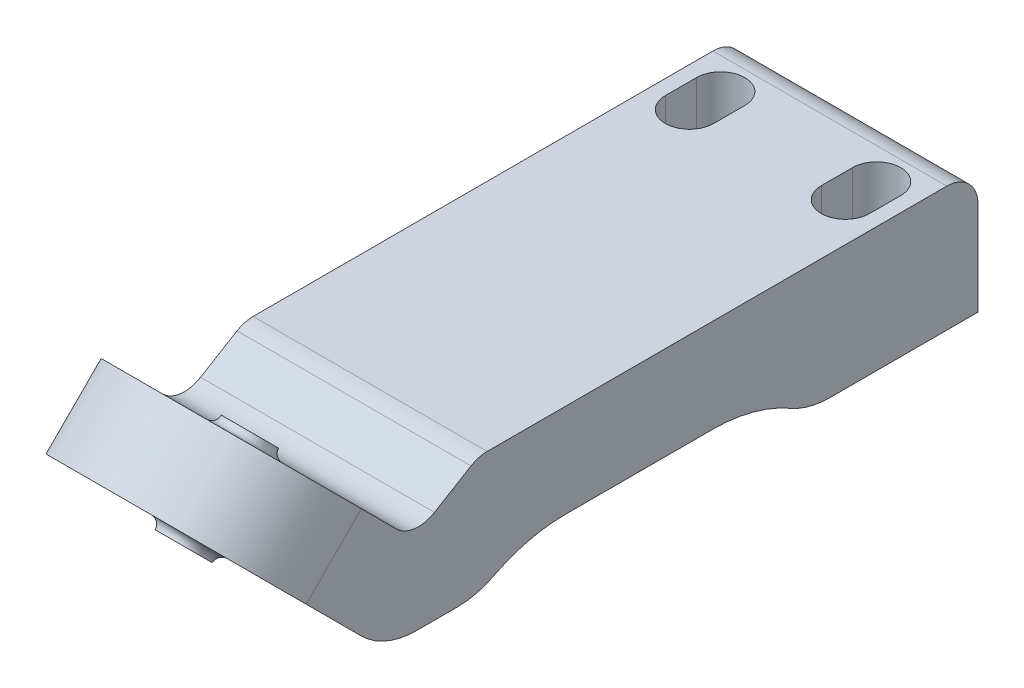
ISO-10303-21;
HEADER;
FILE_DESCRIPTION(('STEP AP214'),'2;1');
FILE_NAME('part.step','',(''),(''),'','','');
FILE_SCHEMA(('AUTOMOTIVE_DESIGN { 1 0 10303 214 1 1 1 1 }'));
ENDSEC;
DATA;
#1=APPLICATION_CONTEXT('core data for automotive mechanical design processes');
#2=APPLICATION_PROTOCOL_DEFINITION('international standard','automotive_design',2000,#1);
#3=PRODUCT_CONTEXT('',#1,'mechanical');
#4=PRODUCT('Part','Part','',(#3));
#5=PRODUCT_RELATED_PRODUCT_CATEGORY('part','',(#4));
#6=PRODUCT_DEFINITION_FORMATION('','',#4);
#7=PRODUCT_DEFINITION_CONTEXT('part definition',#1,'design');
#8=PRODUCT_DEFINITION('design','',#6,#7);
#9=PRODUCT_DEFINITION_SHAPE('','',#8);
#10=(LENGTH_UNIT() NAMED_UNIT(*) SI_UNIT(.MILLI.,.METRE.));
#11=(NAMED_UNIT(*) PLANE_ANGLE_UNIT() SI_UNIT($,.RADIAN.));
#12=(NAMED_UNIT(*) SI_UNIT($,.STERADIAN.) SOLID_ANGLE_UNIT());
#13=UNCERTAINTY_MEASURE_WITH_UNIT(LENGTH_MEASURE(1.E-05),#10,'distance_accuracy_value','');
#14=(GEOMETRIC_REPRESENTATION_CONTEXT(3) GLOBAL_UNCERTAINTY_ASSIGNED_CONTEXT((#13)) GLOBAL_UNIT_ASSIGNED_CONTEXT((#10,
#11,#12)) REPRESENTATION_CONTEXT('',''));
#15=CARTESIAN_POINT('',(0.,0.,0.));
#16=DIRECTION('',(0.,0.,1.));
#17=DIRECTION('',(1.,0.,0.));
#18=AXIS2_PLACEMENT_3D('',#15,#16,#17);
#19=CARTESIAN_POINT('',(-7.5,20.6821178799464,26.));
#20=DIRECTION('',(0.,1.,0.));
#21=DIRECTION('',(0.,0.,1.));
#22=AXIS2_PLACEMENT_3D('',#19,#20,#21);
#23=PLANE('',#22);
#24=DIRECTION('',(0.,0.,-1.));
#25=VECTOR('',#24,1.);
#26=CARTESIAN_POINT('',(6.55,20.6821178799464,26.));
#27=LINE('',#26,#25);
#28=CARTESIAN_POINT('',(6.55,20.6821178799464,6.00000000000001));
#29=VERTEX_POINT('',#28);
#30=CARTESIAN_POINT('',(6.55,20.6821178799464,4.));
#31=VERTEX_POINT('',#30);
#32=EDGE_CURVE('E314',#29,#31,#27,.T.);
#33=ORIENTED_EDGE('',*,*,#32,.T.);
#34=CARTESIAN_POINT('',(5.,20.6821178799464,4.));
#35=DIRECTION('',(0.,1.,0.));
#36=DIRECTION('',(0.,0.,1.));
#37=AXIS2_PLACEMENT_3D('',#34,#35,#36);
#38=CIRCLE('',#37,1.55);
#39=CARTESIAN_POINT('',(3.45,20.6821178799464,4.));
#40=VERTEX_POINT('',#39);
#41=EDGE_CURVE('E317',#31,#40,#38,.T.);
#42=ORIENTED_EDGE('',*,*,#41,.T.);
#43=DIRECTION('',(0.,0.,1.));
#44=VECTOR('',#43,1.);
#45=CARTESIAN_POINT('',(3.45,20.6821178799464,26.));
#46=LINE('',#45,#44);
#47=CARTESIAN_POINT('',(3.45,20.6821178799464,6.00000000000001));
#48=VERTEX_POINT('',#47);
#49=EDGE_CURVE('E308',#40,#48,#46,.T.);
#50=ORIENTED_EDGE('',*,*,#49,.T.);
#51=CARTESIAN_POINT('',(5.,20.6821178799464,6.));
#52=DIRECTION('',(0.,1.,0.));
#53=DIRECTION('',(0.,0.,1.));
#54=AXIS2_PLACEMENT_3D('',#51,#52,#53);
#55=CIRCLE('',#54,1.55);
#56=EDGE_CURVE('E311',#48,#29,#55,.T.);
#57=ORIENTED_EDGE('',*,*,#56,.T.);
#58=EDGE_LOOP('',(#33,#42,#50,#57));
#59=FACE_BOUND('',#58,.T.);
#60=DIRECTION('',(0.,0.,-1.));
#61=VECTOR('',#60,1.);
#62=CARTESIAN_POINT('',(-3.45000000000001,20.6821178799464,26.));
#63=LINE('',#62,#61);
#64=CARTESIAN_POINT('',(-3.45,20.6821178799464,6.));
#65=VERTEX_POINT('',#64);
#66=CARTESIAN_POINT('',(-3.45,20.6821178799464,4.));
#67=VERTEX_POINT('',#66);
#68=EDGE_CURVE('E326',#65,#67,#63,.T.);
#69=ORIENTED_EDGE('',*,*,#68,.T.);
#70=CARTESIAN_POINT('',(-5.,20.6821178799464,4.));
#71=DIRECTION('',(0.,1.,0.));
#72=DIRECTION('',(0.,0.,1.));
#73=AXIS2_PLACEMENT_3D('',#70,#71,#72);
#74=CIRCLE('',#73,1.55);
#75=CARTESIAN_POINT('',(-6.55,20.6821178799464,3.99999999999999));
#76=VERTEX_POINT('',#75);
#77=EDGE_CURVE('E329',#67,#76,#74,.T.);
#78=ORIENTED_EDGE('',*,*,#77,.T.);
#79=DIRECTION('',(0.,0.,1.));
#80=VECTOR('',#79,1.);
#81=CARTESIAN_POINT('',(-6.55,20.6821178799464,26.));
#82=LINE('',#81,#80);
#83=CARTESIAN_POINT('',(-6.55,20.6821178799464,6.));
#84=VERTEX_POINT('',#83);
#85=EDGE_CURVE('E320',#76,#84,#82,.T.);
#86=ORIENTED_EDGE('',*,*,#85,.T.);
#87=CARTESIAN_POINT('',(-5.,20.6821178799464,6.));
#88=DIRECTION('',(0.,1.,0.));
#89=DIRECTION('',(0.,0.,1.));
#90=AXIS2_PLACEMENT_3D('',#87,#88,#89);
#91=CIRCLE('',#90,1.55);
#92=EDGE_CURVE('E323',#84,#65,#91,.T.);
#93=ORIENTED_EDGE('',*,*,#92,.T.);
#94=EDGE_LOOP('',(#69,#78,#86,#93));
#95=FACE_BOUND('',#94,.T.);
#96=DIRECTION('',(0.,0.,-1.));
#97=VECTOR('',#96,1.);
#98=CARTESIAN_POINT('',(7.5,20.6821178799464,26.));
#99=LINE('',#98,#97);
#100=CARTESIAN_POINT('',(7.5,20.6821178799464,9.51668522645211));
#101=VERTEX_POINT('',#100);
#102=CARTESIAN_POINT('',(7.5,20.6821178799464,0.));
#103=VERTEX_POINT('',#102);
#104=EDGE_CURVE('E301',#101,#103,#99,.T.);
#105=ORIENTED_EDGE('',*,*,#104,.F.);
#106=DIRECTION('',(-1.,0.,0.));
#107=VECTOR('',#106,1.);
#108=CARTESIAN_POINT('',(-7.5,20.6821178799464,9.51668522645211));
#109=LINE('',#108,#107);
#110=CARTESIAN_POINT('',(-7.5,20.6821178799464,9.51668522645211));
#111=VERTEX_POINT('',#110);
#112=EDGE_CURVE('E383',#101,#111,#109,.T.);
#113=ORIENTED_EDGE('',*,*,#112,.T.);
#114=DIRECTION('',(0.,0.,-1.));
#115=VECTOR('',#114,1.);
#116=CARTESIAN_POINT('',(-7.5,20.6821178799464,26.));
#117=LINE('',#116,#115);
#118=CARTESIAN_POINT('',(-7.5,20.6821178799464,0.));
#119=VERTEX_POINT('',#118);
#120=EDGE_CURVE('E303',#111,#119,#117,.T.);
#121=ORIENTED_EDGE('',*,*,#120,.T.);
#122=DIRECTION('',(1.,0.,0.));
#123=VECTOR('',#122,1.);
#124=CARTESIAN_POINT('',(-7.5,20.6821178799464,0.));
#125=LINE('',#124,#123);
#126=EDGE_CURVE('E293',#119,#103,#125,.T.);
#127=ORIENTED_EDGE('',*,*,#126,.T.);
#128=EDGE_LOOP('',(#105,#113,#121,#127));
#129=FACE_BOUND('',#128,.T.);
#130=ADVANCED_FACE('F43',(#59,#95,#129),#23,.F.);
#131=CARTESIAN_POINT('',(7.50000000000001,26.,36.));
#132=DIRECTION('',(0.,0.707106781186551,-0.707106781186544));
#133=DIRECTION('',(0.,0.707106781186544,0.707106781186551));
#134=AXIS2_PLACEMENT_3D('',#131,#132,#133);
#135=PLANE('',#134);
#136=CARTESIAN_POINT('',(0.,29.5355339059327,39.5355339059328));
#137=DIRECTION('',(0.,0.707106781186551,-0.707106781186544));
#138=DIRECTION('',(0.,0.707106781186544,0.707106781186551));
#139=AXIS2_PLACEMENT_3D('',#136,#137,#138);
#140=CIRCLE('',#139,2.);
#141=CARTESIAN_POINT('',(0.,30.9497474683058,40.9497474683059));
#142=VERTEX_POINT('',#141);
#143=EDGE_CURVE('E335',#142,#142,#140,.F.);
#144=ORIENTED_EDGE('',*,*,#143,.T.);
#145=EDGE_LOOP('',(#144));
#146=FACE_BOUND('',#145,.T.);
#147=DIRECTION('',(0.,-0.707106781186544,-0.707106781186551));
#148=VECTOR('',#147,1.);
#149=CARTESIAN_POINT('',(7.50000000000001,26.,36.));
#150=LINE('',#149,#148);
#151=CARTESIAN_POINT('',(7.50000000000001,29.5355339059327,39.5355339059327));
#152=VERTEX_POINT('',#151);
#153=CARTESIAN_POINT('',(7.50000000000001,27.2901535386176,37.2901535386177));
#154=VERTEX_POINT('',#153);
#155=EDGE_CURVE('E242',#152,#154,#150,.T.);
#156=ORIENTED_EDGE('',*,*,#155,.T.);
#157=DIRECTION('',(-1.,0.,0.));
#158=VECTOR('',#157,1.);
#159=CARTESIAN_POINT('',(7.50000000000001,27.2901535386176,37.2901535386177));
#160=LINE('',#159,#158);
#161=CARTESIAN_POINT('',(-7.5,27.2901535386176,37.2901535386177));
#162=VERTEX_POINT('',#161);
#163=EDGE_CURVE('E232',#154,#162,#160,.T.);
#164=ORIENTED_EDGE('',*,*,#163,.T.);
#165=DIRECTION('',(0.,-0.707106781186544,-0.707106781186551));
#166=VECTOR('',#165,1.);
#167=CARTESIAN_POINT('',(-7.5,26.,36.));
#168=LINE('',#167,#166);
#169=CARTESIAN_POINT('',(-7.5,29.5355339059327,39.5355339059327));
#170=VERTEX_POINT('',#169);
#171=EDGE_CURVE('E225',#170,#162,#168,.T.);
#172=ORIENTED_EDGE('',*,*,#171,.F.);
#173=CARTESIAN_POINT('',(0.,29.5355339059327,39.5355339059327));
#174=DIRECTION('',(0.,-0.707106781186551,0.707106781186544));
#175=DIRECTION('',(0.,0.707106781186544,0.707106781186551));
#176=AXIS2_PLACEMENT_3D('',#173,#174,#175);
#177=CIRCLE('',#176,7.5);
#178=EDGE_CURVE('E209',#152,#170,#177,.T.);
#179=ORIENTED_EDGE('',*,*,#178,.F.);
#180=EDGE_LOOP('',(#156,#164,#172,#179));
#181=FACE_BOUND('',#180,.T.);
#182=ADVANCED_FACE('F230',(#146,#181),#135,.T.);
#183=CARTESIAN_POINT('',(7.50000000000001,26.,43.0710678118655));
#184=DIRECTION('',(0.,-0.707106781186551,0.707106781186544));
#185=DIRECTION('',(0.,-0.707106781186544,-0.707106781186551));
#186=AXIS2_PLACEMENT_3D('',#183,#184,#185);
#187=PLANE('',#186);
#188=CARTESIAN_POINT('',(0.,26.,43.0710678118655));
#189=DIRECTION('',(0.,-0.707106781186551,0.707106781186544));
#190=DIRECTION('',(0.,-0.707106781186544,-0.707106781186551));
#191=AXIS2_PLACEMENT_3D('',#188,#189,#190);
#192=CIRCLE('',#191,2.);
#193=CARTESIAN_POINT('',(0.,24.5857864376269,41.6568542494924));
#194=VERTEX_POINT('',#193);
#195=EDGE_CURVE('E332',#194,#194,#192,.F.);
#196=ORIENTED_EDGE('',*,*,#195,.T.);
#197=EDGE_LOOP('',(#196));
#198=FACE_BOUND('',#197,.T.);
#199=DIRECTION('',(0.,0.707106781186544,0.707106781186551));
#200=VECTOR('',#199,1.);
#201=CARTESIAN_POINT('',(-7.5,26.,43.0710678118655));
#202=LINE('',#201,#200);
#203=CARTESIAN_POINT('',(-7.5,22.4644660940672,39.5355339059327));
#204=VERTEX_POINT('',#203);
#205=CARTESIAN_POINT('',(-7.5,26.,43.0710678118655));
#206=VERTEX_POINT('',#205);
#207=EDGE_CURVE('E220',#204,#206,#202,.T.);
#208=ORIENTED_EDGE('',*,*,#207,.F.);
#209=DIRECTION('',(-1.,0.,0.));
#210=VECTOR('',#209,1.);
#211=CARTESIAN_POINT('',(7.50000000000001,22.4644660940672,39.5355339059327));
#212=LINE('',#211,#210);
#213=CARTESIAN_POINT('',(7.50000000000001,22.4644660940672,39.5355339059327));
#214=VERTEX_POINT('',#213);
#215=EDGE_CURVE('E397',#204,#214,#212,.F.);
#216=ORIENTED_EDGE('',*,*,#215,.T.);
#217=DIRECTION('',(0.,0.707106781186544,0.707106781186551));
#218=VECTOR('',#217,1.);
#219=CARTESIAN_POINT('',(7.50000000000001,26.,43.0710678118655));
#220=LINE('',#219,#218);
#221=CARTESIAN_POINT('',(7.50000000000001,26.,43.0710678118655));
#222=VERTEX_POINT('',#221);
#223=EDGE_CURVE('E233',#214,#222,#220,.T.);
#224=ORIENTED_EDGE('',*,*,#223,.T.);
#225=CARTESIAN_POINT('',(0.,26.,43.0710678118655));
#226=DIRECTION('',(0.,-0.707106781186551,0.707106781186544));
#227=DIRECTION('',(0.,0.707106781186544,0.707106781186551));
#228=AXIS2_PLACEMENT_3D('',#225,#226,#227);
#229=CIRCLE('',#228,7.5);
#230=EDGE_CURVE('E221',#222,#206,#229,.T.);
#231=ORIENTED_EDGE('',*,*,#230,.T.);
#232=EDGE_LOOP('',(#208,#216,#224,#231));
#233=FACE_BOUND('',#232,.T.);
#234=ADVANCED_FACE('F436',(#198,#233),#187,.T.);
#235=CARTESIAN_POINT('',(7.5,28.6821178799464,26.));
#236=DIRECTION('',(0.,-1.,0.));
#237=DIRECTION('',(0.,0.,-1.));
#238=AXIS2_PLACEMENT_3D('',#235,#236,#237);
#239=PLANE('',#238);
#240=DIRECTION('',(0.,0.,1.));
#241=VECTOR('',#240,1.);
#242=CARTESIAN_POINT('',(-6.55,28.6821178799464,3.99999999999999));
#243=LINE('',#242,#241);
#244=CARTESIAN_POINT('',(-6.55,28.6821178799464,3.99999999999999));
#245=VERTEX_POINT('',#244);
#246=CARTESIAN_POINT('',(-6.55,28.6821178799464,6.00000000000001));
#247=VERTEX_POINT('',#246);
#248=EDGE_CURVE('E254',#245,#247,#243,.T.);
#249=ORIENTED_EDGE('',*,*,#248,.F.);
#250=CARTESIAN_POINT('',(-5.,28.6821178799464,4.));
#251=DIRECTION('',(0.,1.,0.));
#252=DIRECTION('',(0.,0.,1.));
#253=AXIS2_PLACEMENT_3D('',#250,#251,#252);
#254=CIRCLE('',#253,1.55);
#255=CARTESIAN_POINT('',(-3.45,28.6821178799464,4.));
#256=VERTEX_POINT('',#255);
#257=EDGE_CURVE('E252',#256,#245,#254,.T.);
#258=ORIENTED_EDGE('',*,*,#257,.F.);
#259=DIRECTION('',(0.,0.,-1.));
#260=VECTOR('',#259,1.);
#261=CARTESIAN_POINT('',(-3.45,28.6821178799464,4.));
#262=LINE('',#261,#260);
#263=CARTESIAN_POINT('',(-3.45,28.6821178799464,6.));
#264=VERTEX_POINT('',#263);
#265=EDGE_CURVE('E261',#264,#256,#262,.T.);
#266=ORIENTED_EDGE('',*,*,#265,.F.);
#267=CARTESIAN_POINT('',(-5.,28.6821178799464,6.));
#268=DIRECTION('',(0.,1.,0.));
#269=DIRECTION('',(0.,0.,1.));
#270=AXIS2_PLACEMENT_3D('',#267,#268,#269);
#271=CIRCLE('',#270,1.55);
#272=EDGE_CURVE('E258',#247,#264,#271,.T.);
#273=ORIENTED_EDGE('',*,*,#272,.F.);
#274=EDGE_LOOP('',(#249,#258,#266,#273));
#275=FACE_BOUND('',#274,.T.);
#276=DIRECTION('',(0.,0.,1.));
#277=VECTOR('',#276,1.);
#278=CARTESIAN_POINT('',(3.45,28.6821178799464,4.));
#279=LINE('',#278,#277);
#280=CARTESIAN_POINT('',(3.45000000000001,28.6821178799464,4.));
#281=VERTEX_POINT('',#280);
#282=CARTESIAN_POINT('',(3.45,28.6821178799464,6.00000000000001));
#283=VERTEX_POINT('',#282);
#284=EDGE_CURVE('E288',#281,#283,#279,.T.);
#285=ORIENTED_EDGE('',*,*,#284,.F.);
#286=CARTESIAN_POINT('',(5.,28.6821178799464,4.));
#287=DIRECTION('',(0.,1.,0.));
#288=DIRECTION('',(0.,0.,-1.));
#289=AXIS2_PLACEMENT_3D('',#286,#287,#288);
#290=CIRCLE('',#289,1.55);
#291=CARTESIAN_POINT('',(6.55,28.6821178799464,4.));
#292=VERTEX_POINT('',#291);
#293=EDGE_CURVE('E255',#292,#281,#290,.T.);
#294=ORIENTED_EDGE('',*,*,#293,.F.);
#295=DIRECTION('',(0.,0.,-1.));
#296=VECTOR('',#295,1.);
#297=CARTESIAN_POINT('',(6.55,28.6821178799464,4.));
#298=LINE('',#297,#296);
#299=CARTESIAN_POINT('',(6.55,28.6821178799464,6.00000000000001));
#300=VERTEX_POINT('',#299);
#301=EDGE_CURVE('E277',#300,#292,#298,.T.);
#302=ORIENTED_EDGE('',*,*,#301,.F.);
#303=CARTESIAN_POINT('',(5.,28.6821178799464,6.));
#304=DIRECTION('',(0.,1.,0.));
#305=DIRECTION('',(0.,0.,-1.));
#306=AXIS2_PLACEMENT_3D('',#303,#304,#305);
#307=CIRCLE('',#306,1.55);
#308=EDGE_CURVE('E285',#283,#300,#307,.T.);
#309=ORIENTED_EDGE('',*,*,#308,.F.);
#310=EDGE_LOOP('',(#285,#294,#302,#309));
#311=FACE_BOUND('',#310,.T.);
#312=DIRECTION('',(0.,0.,-1.));
#313=VECTOR('',#312,1.);
#314=CARTESIAN_POINT('',(7.5,28.6821178799464,26.));
#315=LINE('',#314,#313);
#316=CARTESIAN_POINT('',(7.5,28.6821178799464,31.4751117573865));
#317=VERTEX_POINT('',#316);
#318=CARTESIAN_POINT('',(7.5,28.6821178799464,2.00000000000001));
#319=VERTEX_POINT('',#318);
#320=EDGE_CURVE('E298',#317,#319,#315,.T.);
#321=ORIENTED_EDGE('',*,*,#320,.T.);
#322=DIRECTION('',(-1.,0.,0.));
#323=VECTOR('',#322,1.);
#324=CARTESIAN_POINT('',(7.5,28.6821178799464,2.));
#325=LINE('',#324,#323);
#326=CARTESIAN_POINT('',(-7.5,28.6821178799464,2.00000000000001));
#327=VERTEX_POINT('',#326);
#328=EDGE_CURVE('E401',#319,#327,#325,.T.);
#329=ORIENTED_EDGE('',*,*,#328,.T.);
#330=DIRECTION('',(0.,0.,-1.));
#331=VECTOR('',#330,1.);
#332=CARTESIAN_POINT('',(-7.5,28.6821178799464,26.));
#333=LINE('',#332,#331);
#334=CARTESIAN_POINT('',(-7.5,28.6821178799464,31.4751117573865));
#335=VERTEX_POINT('',#334);
#336=EDGE_CURVE('E306',#335,#327,#333,.T.);
#337=ORIENTED_EDGE('',*,*,#336,.F.);
#338=DIRECTION('',(1.,0.,0.));
#339=VECTOR('',#338,1.);
#340=CARTESIAN_POINT('',(7.5,28.6821178799464,31.4751117573865));
#341=LINE('',#340,#339);
#342=EDGE_CURVE('E344',#335,#317,#341,.T.);
#343=ORIENTED_EDGE('',*,*,#342,.T.);
#344=EDGE_LOOP('',(#321,#329,#337,#343));
#345=FACE_BOUND('',#344,.T.);
#346=ADVANCED_FACE('F407',(#275,#311,#345),#239,.F.);
#347=CARTESIAN_POINT('',(-7.5,28.6821178799464,26.));
#348=DIRECTION('',(1.,0.,0.));
#349=DIRECTION('',(0.,0.,-1.));
#350=AXIS2_PLACEMENT_3D('',#347,#348,#349);
#351=PLANE('',#350);
#352=ORIENTED_EDGE('',*,*,#336,.T.);
#353=CARTESIAN_POINT('',(-7.5,26.6821178799464,2.));
#354=DIRECTION('',(1.,0.,0.));
#355=DIRECTION('',(0.,0.,-1.));
#356=AXIS2_PLACEMENT_3D('',#353,#354,#355);
#357=CIRCLE('',#356,2.);
#358=CARTESIAN_POINT('',(-7.5,26.6821178799464,0.));
#359=VERTEX_POINT('',#358);
#360=EDGE_CURVE('E65',#327,#359,#357,.F.);
#361=ORIENTED_EDGE('',*,*,#360,.T.);
#362=DIRECTION('',(0.,-1.,0.));
#363=VECTOR('',#362,1.);
#364=CARTESIAN_POINT('',(-7.5,28.6821178799464,0.));
#365=LINE('',#364,#363);
#366=EDGE_CURVE('E267',#359,#119,#365,.T.);
#367=ORIENTED_EDGE('',*,*,#366,.T.);
#368=ORIENTED_EDGE('',*,*,#120,.F.);
#369=CARTESIAN_POINT('',(-7.5,25.6821178799464,9.51668522645211));
#370=DIRECTION('',(1.,0.,0.));
#371=DIRECTION('',(0.,0.,-1.));
#372=AXIS2_PLACEMENT_3D('',#369,#370,#371);
#373=CIRCLE('',#372,5.);
#374=CARTESIAN_POINT('',(-7.5,21.3487845466131,12.0111234843014));
#375=VERTEX_POINT('',#374);
#376=EDGE_CURVE('E389',#111,#375,#373,.F.);
#377=ORIENTED_EDGE('',*,*,#376,.T.);
#378=CARTESIAN_POINT('',(-7.5,12.6821178799464,17.));
#379=DIRECTION('',(1.,0.,0.));
#380=DIRECTION('',(0.,0.,-1.));
#381=AXIS2_PLACEMENT_3D('',#378,#379,#380);
#382=CIRCLE('',#381,10.);
#383=CARTESIAN_POINT('',(-7.5,22.6821178799464,17.));
#384=VERTEX_POINT('',#383);
#385=EDGE_CURVE('E364',#375,#384,#382,.T.);
#386=ORIENTED_EDGE('',*,*,#385,.T.);
#387=DIRECTION('',(0.,0.,-1.));
#388=VECTOR('',#387,1.);
#389=CARTESIAN_POINT('',(-7.5,22.6821178799464,32.));
#390=LINE('',#389,#388);
#391=CARTESIAN_POINT('',(-7.5,22.6821178799464,26.4490688135329));
#392=VERTEX_POINT('',#391);
#393=EDGE_CURVE('E248',#392,#384,#390,.T.);
#394=ORIENTED_EDGE('',*,*,#393,.F.);
#395=CARTESIAN_POINT('',(-7.5,12.6821178799464,26.4490688135329));
#396=DIRECTION('',(1.,0.,0.));
#397=DIRECTION('',(0.,0.,-1.));
#398=AXIS2_PLACEMENT_3D('',#395,#396,#397);
#399=CIRCLE('',#398,10.);
#400=CARTESIAN_POINT('',(-7.5,21.5607059599821,31.0502288525934));
#401=VERTEX_POINT('',#400);
#402=EDGE_CURVE('E371',#392,#401,#399,.T.);
#403=ORIENTED_EDGE('',*,*,#402,.T.);
#404=CARTESIAN_POINT('',(-7.5,26.,33.3508088721237));
#405=DIRECTION('',(1.,0.,0.));
#406=DIRECTION('',(0.,0.,-1.));
#407=AXIS2_PLACEMENT_3D('',#404,#405,#406);
#408=CIRCLE('',#407,5.);
#409=CARTESIAN_POINT('',(-7.5,21.,33.3508088721237));
#410=VERTEX_POINT('',#409);
#411=EDGE_CURVE('E385',#401,#410,#408,.F.);
#412=ORIENTED_EDGE('',*,*,#411,.T.);
#413=DIRECTION('',(0.,0.,-1.));
#414=VECTOR('',#413,1.);
#415=CARTESIAN_POINT('',(-7.5,21.,36.));
#416=LINE('',#415,#414);
#417=CARTESIAN_POINT('',(-7.5,21.,36.));
#418=VERTEX_POINT('',#417);
#419=EDGE_CURVE('E241',#418,#410,#416,.T.);
#420=ORIENTED_EDGE('',*,*,#419,.F.);
#421=CARTESIAN_POINT('',(-7.5,26.,36.));
#422=DIRECTION('',(1.,0.,0.));
#423=DIRECTION('',(0.,0.,-1.));
#424=AXIS2_PLACEMENT_3D('',#421,#422,#423);
#425=CIRCLE('',#424,5.);
#426=EDGE_CURVE('E387',#418,#204,#425,.F.);
#427=ORIENTED_EDGE('',*,*,#426,.T.);
#428=ORIENTED_EDGE('',*,*,#207,.T.);
#429=DIRECTION('',(0.,0.707106781186551,-0.707106781186544));
#430=VECTOR('',#429,1.);
#431=CARTESIAN_POINT('',(-7.5,29.5355339059327,39.5355339059328));
#432=LINE('',#431,#430);
#433=EDGE_CURVE('E213',#206,#170,#432,.T.);
#434=ORIENTED_EDGE('',*,*,#433,.T.);
#435=ORIENTED_EDGE('',*,*,#171,.T.);
#436=CARTESIAN_POINT('',(-7.5,28.7043671009907,35.8759399762446));
#437=DIRECTION('',(1.,0.,0.));
#438=DIRECTION('',(0.,0.,-1.));
#439=AXIS2_PLACEMENT_3D('',#436,#437,#438);
#440=CIRCLE('',#439,2.);
#441=CARTESIAN_POINT('',(-7.5,26.9900324995865,34.8458638264245));
#442=VERTEX_POINT('',#441);
#443=EDGE_CURVE('E356',#162,#442,#440,.T.);
#444=ORIENTED_EDGE('',*,*,#443,.T.);
#445=DIRECTION('',(0.,0.515038074910051,-0.857167300702114));
#446=VECTOR('',#445,1.);
#447=CARTESIAN_POINT('',(-7.5,31.3440992919738,27.5994797990706));
#448=LINE('',#447,#446);
#449=CARTESIAN_POINT('',(-7.5,28.3964524813507,32.5051879072065));
#450=VERTEX_POINT('',#449);
#451=EDGE_CURVE('E338',#442,#450,#448,.T.);
#452=ORIENTED_EDGE('',*,*,#451,.T.);
#453=CARTESIAN_POINT('',(-7.5,26.6821178799464,31.4751117573865));
#454=DIRECTION('',(1.,0.,0.));
#455=DIRECTION('',(0.,0.,-1.));
#456=AXIS2_PLACEMENT_3D('',#453,#454,#455);
#457=CIRCLE('',#456,2.);
#458=EDGE_CURVE('E353',#450,#335,#457,.F.);
#459=ORIENTED_EDGE('',*,*,#458,.T.);
#460=EDGE_LOOP('',(#352,#361,#367,#368,#377,#386,#394,#403,#412,#420,#427,#428,#434,#435,#444,
#452,#459));
#461=FACE_BOUND('',#460,.T.);
#462=ADVANCED_FACE('F224',(#461),#351,.F.);
#463=CARTESIAN_POINT('',(7.5,20.6821178799464,26.));
#464=DIRECTION('',(-1.,0.,0.));
#465=DIRECTION('',(0.,0.,1.));
#466=AXIS2_PLACEMENT_3D('',#463,#464,#465);
#467=PLANE('',#466);
#468=DIRECTION('',(0.,1.,0.));
#469=VECTOR('',#468,1.);
#470=CARTESIAN_POINT('',(7.5,20.6821178799464,0.));
#471=LINE('',#470,#469);
#472=CARTESIAN_POINT('',(7.5,26.6821178799464,0.));
#473=VERTEX_POINT('',#472);
#474=EDGE_CURVE('E296',#103,#473,#471,.T.);
#475=ORIENTED_EDGE('',*,*,#474,.T.);
#476=CARTESIAN_POINT('',(7.5,26.6821178799464,2.));
#477=DIRECTION('',(-1.,0.,0.));
#478=DIRECTION('',(0.,0.,1.));
#479=AXIS2_PLACEMENT_3D('',#476,#477,#478);
#480=CIRCLE('',#479,2.);
#481=EDGE_CURVE('E11',#473,#319,#480,.F.);
#482=ORIENTED_EDGE('',*,*,#481,.T.);
#483=ORIENTED_EDGE('',*,*,#320,.F.);
#484=CARTESIAN_POINT('',(7.5,26.6821178799464,31.4751117573865));
#485=DIRECTION('',(-1.,0.,0.));
#486=DIRECTION('',(0.,0.,1.));
#487=AXIS2_PLACEMENT_3D('',#484,#485,#486);
#488=CIRCLE('',#487,2.);
#489=CARTESIAN_POINT('',(7.5,28.3964524813507,32.5051879072065));
#490=VERTEX_POINT('',#489);
#491=EDGE_CURVE('E347',#317,#490,#488,.F.);
#492=ORIENTED_EDGE('',*,*,#491,.T.);
#493=DIRECTION('',(0.,-0.515038074910051,0.857167300702114));
#494=VECTOR('',#493,1.);
#495=CARTESIAN_POINT('',(7.5,29.2219855431173,31.1312701705063));
#496=LINE('',#495,#494);
#497=CARTESIAN_POINT('',(7.5,26.9900324995865,34.8458638264245));
#498=VERTEX_POINT('',#497);
#499=EDGE_CURVE('E341',#490,#498,#496,.T.);
#500=ORIENTED_EDGE('',*,*,#499,.T.);
#501=CARTESIAN_POINT('',(7.5,28.7043671009907,35.8759399762446));
#502=DIRECTION('',(-1.,0.,0.));
#503=DIRECTION('',(0.,0.,1.));
#504=AXIS2_PLACEMENT_3D('',#501,#502,#503);
#505=CIRCLE('',#504,2.);
#506=EDGE_CURVE('E358',#498,#154,#505,.T.);
#507=ORIENTED_EDGE('',*,*,#506,.T.);
#508=ORIENTED_EDGE('',*,*,#155,.F.);
#509=DIRECTION('',(0.,0.707106781186551,-0.707106781186544));
#510=VECTOR('',#509,1.);
#511=CARTESIAN_POINT('',(7.50000000000001,29.5355339059327,39.5355339059328));
#512=LINE('',#511,#510);
#513=EDGE_CURVE('E215',#222,#152,#512,.T.);
#514=ORIENTED_EDGE('',*,*,#513,.F.);
#515=ORIENTED_EDGE('',*,*,#223,.F.);
#516=CARTESIAN_POINT('',(7.5,26.,36.));
#517=DIRECTION('',(-1.,0.,0.));
#518=DIRECTION('',(0.,0.,1.));
#519=AXIS2_PLACEMENT_3D('',#516,#517,#518);
#520=CIRCLE('',#519,5.);
#521=CARTESIAN_POINT('',(7.5,21.,36.));
#522=VERTEX_POINT('',#521);
#523=EDGE_CURVE('E379',#214,#522,#520,.F.);
#524=ORIENTED_EDGE('',*,*,#523,.T.);
#525=DIRECTION('',(0.,0.,-1.));
#526=VECTOR('',#525,1.);
#527=CARTESIAN_POINT('',(7.5,21.,36.));
#528=LINE('',#527,#526);
#529=CARTESIAN_POINT('',(7.5,21.,33.3508088721237));
#530=VERTEX_POINT('',#529);
#531=EDGE_CURVE('E238',#522,#530,#528,.T.);
#532=ORIENTED_EDGE('',*,*,#531,.T.);
#533=CARTESIAN_POINT('',(7.5,26.,33.3508088721237));
#534=DIRECTION('',(-1.,0.,0.));
#535=DIRECTION('',(0.,0.,1.));
#536=AXIS2_PLACEMENT_3D('',#533,#534,#535);
#537=CIRCLE('',#536,5.);
#538=CARTESIAN_POINT('',(7.5,21.5607059599821,31.0502288525934));
#539=VERTEX_POINT('',#538);
#540=EDGE_CURVE('E377',#530,#539,#537,.F.);
#541=ORIENTED_EDGE('',*,*,#540,.T.);
#542=CARTESIAN_POINT('',(7.5,12.6821178799464,26.4490688135329));
#543=DIRECTION('',(-1.,0.,0.));
#544=DIRECTION('',(0.,0.,1.));
#545=AXIS2_PLACEMENT_3D('',#542,#543,#544);
#546=CIRCLE('',#545,10.);
#547=CARTESIAN_POINT('',(7.5,22.6821178799464,26.4490688135329));
#548=VERTEX_POINT('',#547);
#549=EDGE_CURVE('E369',#539,#548,#546,.T.);
#550=ORIENTED_EDGE('',*,*,#549,.T.);
#551=DIRECTION('',(0.,0.,-1.));
#552=VECTOR('',#551,1.);
#553=CARTESIAN_POINT('',(7.5,22.6821178799464,32.));
#554=LINE('',#553,#552);
#555=CARTESIAN_POINT('',(7.5,22.6821178799464,17.));
#556=VERTEX_POINT('',#555);
#557=EDGE_CURVE('E245',#548,#556,#554,.T.);
#558=ORIENTED_EDGE('',*,*,#557,.T.);
#559=CARTESIAN_POINT('',(7.5,12.6821178799464,17.));
#560=DIRECTION('',(-1.,0.,0.));
#561=DIRECTION('',(0.,0.,1.));
#562=AXIS2_PLACEMENT_3D('',#559,#560,#561);
#563=CIRCLE('',#562,10.);
#564=CARTESIAN_POINT('',(7.5,21.3487845466131,12.0111234843014));
#565=VERTEX_POINT('',#564);
#566=EDGE_CURVE('E366',#556,#565,#563,.T.);
#567=ORIENTED_EDGE('',*,*,#566,.T.);
#568=CARTESIAN_POINT('',(7.5,25.6821178799464,9.51668522645211));
#569=DIRECTION('',(-1.,0.,0.));
#570=DIRECTION('',(0.,0.,1.));
#571=AXIS2_PLACEMENT_3D('',#568,#569,#570);
#572=CIRCLE('',#571,5.);
#573=EDGE_CURVE('E381',#565,#101,#572,.F.);
#574=ORIENTED_EDGE('',*,*,#573,.T.);
#575=ORIENTED_EDGE('',*,*,#104,.T.);
#576=EDGE_LOOP('',(#475,#482,#483,#492,#500,#507,#508,#514,#515,#524,#532,#541,#550,#558,#567,
#574,#575));
#577=FACE_BOUND('',#576,.T.);
#578=ADVANCED_FACE('F418',(#577),#467,.F.);
#579=CARTESIAN_POINT('',(0.,0.,0.));
#580=DIRECTION('',(0.,0.,1.));
#581=DIRECTION('',(1.,0.,0.));
#582=AXIS2_PLACEMENT_3D('',#579,#580,#581);
#583=PLANE('',#582);
#584=ORIENTED_EDGE('',*,*,#366,.F.);
#585=DIRECTION('',(-1.,0.,0.));
#586=VECTOR('',#585,1.);
#587=CARTESIAN_POINT('',(0.,26.6821178799464,0.));
#588=LINE('',#587,#586);
#589=EDGE_CURVE('E51',#359,#473,#588,.F.);
#590=ORIENTED_EDGE('',*,*,#589,.T.);
#591=ORIENTED_EDGE('',*,*,#474,.F.);
#592=ORIENTED_EDGE('',*,*,#126,.F.);
#593=EDGE_LOOP('',(#584,#590,#591,#592));
#594=FACE_BOUND('',#593,.T.);
#595=ADVANCED_FACE('F514',(#594),#583,.F.);
#596=CARTESIAN_POINT('',(5.,17.6821178799464,4.));
#597=DIRECTION('',(0.,1.,0.));
#598=DIRECTION('',(0.,0.,1.));
#599=AXIS2_PLACEMENT_3D('',#596,#597,#598);
#600=CYLINDRICAL_SURFACE('',#599,1.55);
#601=DIRECTION('',(0.,1.,0.));
#602=VECTOR('',#601,1.);
#603=CARTESIAN_POINT('',(6.55,17.6821178799464,4.));
#604=LINE('',#603,#602);
#605=EDGE_CURVE('E251',#31,#292,#604,.T.);
#606=ORIENTED_EDGE('',*,*,#605,.T.);
#607=ORIENTED_EDGE('',*,*,#293,.T.);
#608=DIRECTION('',(0.,1.,0.));
#609=VECTOR('',#608,1.);
#610=CARTESIAN_POINT('',(3.45,17.6821178799464,4.));
#611=LINE('',#610,#609);
#612=EDGE_CURVE('E274',#40,#281,#611,.T.);
#613=ORIENTED_EDGE('',*,*,#612,.F.);
#614=ORIENTED_EDGE('',*,*,#41,.F.);
#615=EDGE_LOOP('',(#606,#607,#613,#614));
#616=FACE_BOUND('',#615,.T.);
#617=ADVANCED_FACE('F515',(#616),#600,.F.);
#618=CARTESIAN_POINT('',(6.55,17.6821178799464,4.));
#619=DIRECTION('',(1.,0.,0.));
#620=DIRECTION('',(0.,0.,-1.));
#621=AXIS2_PLACEMENT_3D('',#618,#619,#620);
#622=PLANE('',#621);
#623=DIRECTION('',(0.,1.,0.));
#624=VECTOR('',#623,1.);
#625=CARTESIAN_POINT('',(6.55,17.6821178799464,6.00000000000001));
#626=LINE('',#625,#624);
#627=EDGE_CURVE('E280',#29,#300,#626,.T.);
#628=ORIENTED_EDGE('',*,*,#627,.T.);
#629=ORIENTED_EDGE('',*,*,#301,.T.);
#630=ORIENTED_EDGE('',*,*,#605,.F.);
#631=ORIENTED_EDGE('',*,*,#32,.F.);
#632=EDGE_LOOP('',(#628,#629,#630,#631));
#633=FACE_BOUND('',#632,.T.);
#634=ADVANCED_FACE('F520',(#633),#622,.F.);
#635=CARTESIAN_POINT('',(5.,17.6821178799464,6.));
#636=DIRECTION('',(0.,1.,0.));
#637=DIRECTION('',(0.,0.,1.));
#638=AXIS2_PLACEMENT_3D('',#635,#636,#637);
#639=CYLINDRICAL_SURFACE('',#638,1.55);
#640=DIRECTION('',(0.,1.,0.));
#641=VECTOR('',#640,1.);
#642=CARTESIAN_POINT('',(3.45,17.6821178799464,6.00000000000001));
#643=LINE('',#642,#641);
#644=EDGE_CURVE('E278',#48,#283,#643,.T.);
#645=ORIENTED_EDGE('',*,*,#644,.T.);
#646=ORIENTED_EDGE('',*,*,#308,.T.);
#647=ORIENTED_EDGE('',*,*,#627,.F.);
#648=ORIENTED_EDGE('',*,*,#56,.F.);
#649=EDGE_LOOP('',(#645,#646,#647,#648));
#650=FACE_BOUND('',#649,.T.);
#651=ADVANCED_FACE('F526',(#650),#639,.F.);
#652=CARTESIAN_POINT('',(3.45,17.6821178799464,4.));
#653=DIRECTION('',(-1.,0.,0.));
#654=DIRECTION('',(0.,0.,1.));
#655=AXIS2_PLACEMENT_3D('',#652,#653,#654);
#656=PLANE('',#655);
#657=ORIENTED_EDGE('',*,*,#612,.T.);
#658=ORIENTED_EDGE('',*,*,#284,.T.);
#659=ORIENTED_EDGE('',*,*,#644,.F.);
#660=ORIENTED_EDGE('',*,*,#49,.F.);
#661=EDGE_LOOP('',(#657,#658,#659,#660));
#662=FACE_BOUND('',#661,.T.);
#663=ADVANCED_FACE('F530',(#662),#656,.F.);
#664=CARTESIAN_POINT('',(-5.,17.6821178799464,4.));
#665=DIRECTION('',(0.,1.,0.));
#666=DIRECTION('',(0.,0.,1.));
#667=AXIS2_PLACEMENT_3D('',#664,#665,#666);
#668=CYLINDRICAL_SURFACE('',#667,1.55);
#669=DIRECTION('',(0.,1.,0.));
#670=VECTOR('',#669,1.);
#671=CARTESIAN_POINT('',(-3.45,17.6821178799464,4.));
#672=LINE('',#671,#670);
#673=EDGE_CURVE('E265',#67,#256,#672,.T.);
#674=ORIENTED_EDGE('',*,*,#673,.T.);
#675=ORIENTED_EDGE('',*,*,#257,.T.);
#676=DIRECTION('',(0.,1.,0.));
#677=VECTOR('',#676,1.);
#678=CARTESIAN_POINT('',(-6.55,17.6821178799464,3.99999999999999));
#679=LINE('',#678,#677);
#680=EDGE_CURVE('E264',#76,#245,#679,.T.);
#681=ORIENTED_EDGE('',*,*,#680,.F.);
#682=ORIENTED_EDGE('',*,*,#77,.F.);
#683=EDGE_LOOP('',(#674,#675,#681,#682));
#684=FACE_BOUND('',#683,.T.);
#685=ADVANCED_FACE('F533',(#684),#668,.F.);
#686=CARTESIAN_POINT('',(-3.45,17.6821178799464,4.));
#687=DIRECTION('',(1.,0.,0.));
#688=DIRECTION('',(0.,0.,-1.));
#689=AXIS2_PLACEMENT_3D('',#686,#687,#688);
#690=PLANE('',#689);
#691=DIRECTION('',(0.,1.,0.));
#692=VECTOR('',#691,1.);
#693=CARTESIAN_POINT('',(-3.45,17.6821178799464,6.));
#694=LINE('',#693,#692);
#695=EDGE_CURVE('E268',#65,#264,#694,.T.);
#696=ORIENTED_EDGE('',*,*,#695,.T.);
#697=ORIENTED_EDGE('',*,*,#265,.T.);
#698=ORIENTED_EDGE('',*,*,#673,.F.);
#699=ORIENTED_EDGE('',*,*,#68,.F.);
#700=EDGE_LOOP('',(#696,#697,#698,#699));
#701=FACE_BOUND('',#700,.T.);
#702=ADVANCED_FACE('F538',(#701),#690,.F.);
#703=CARTESIAN_POINT('',(-5.,17.6821178799464,6.));
#704=DIRECTION('',(0.,1.,0.));
#705=DIRECTION('',(0.,0.,1.));
#706=AXIS2_PLACEMENT_3D('',#703,#704,#705);
#707=CYLINDRICAL_SURFACE('',#706,1.55);
#708=DIRECTION('',(0.,1.,0.));
#709=VECTOR('',#708,1.);
#710=CARTESIAN_POINT('',(-6.55,17.6821178799464,6.00000000000001));
#711=LINE('',#710,#709);
#712=EDGE_CURVE('E270',#84,#247,#711,.T.);
#713=ORIENTED_EDGE('',*,*,#712,.T.);
#714=ORIENTED_EDGE('',*,*,#272,.T.);
#715=ORIENTED_EDGE('',*,*,#695,.F.);
#716=ORIENTED_EDGE('',*,*,#92,.F.);
#717=EDGE_LOOP('',(#713,#714,#715,#716));
#718=FACE_BOUND('',#717,.T.);
#719=ADVANCED_FACE('F543',(#718),#707,.F.);
#720=CARTESIAN_POINT('',(-6.55,17.6821178799464,3.99999999999999));
#721=DIRECTION('',(-1.,0.,0.));
#722=DIRECTION('',(0.,0.,1.));
#723=AXIS2_PLACEMENT_3D('',#720,#721,#722);
#724=PLANE('',#723);
#725=ORIENTED_EDGE('',*,*,#680,.T.);
#726=ORIENTED_EDGE('',*,*,#248,.T.);
#727=ORIENTED_EDGE('',*,*,#712,.F.);
#728=ORIENTED_EDGE('',*,*,#85,.F.);
#729=EDGE_LOOP('',(#725,#726,#727,#728));
#730=FACE_BOUND('',#729,.T.);
#731=ADVANCED_FACE('F540',(#730),#724,.F.);
#732=CARTESIAN_POINT('',(-7.5,22.6821178799464,32.));
#733=DIRECTION('',(0.,1.,0.));
#734=DIRECTION('',(0.,0.,1.));
#735=AXIS2_PLACEMENT_3D('',#732,#733,#734);
#736=PLANE('',#735);
#737=ORIENTED_EDGE('',*,*,#393,.T.);
#738=DIRECTION('',(-1.,0.,0.));
#739=VECTOR('',#738,1.);
#740=CARTESIAN_POINT('',(-7.5,22.6821178799464,17.));
#741=LINE('',#740,#739);
#742=EDGE_CURVE('E362',#384,#556,#741,.F.);
#743=ORIENTED_EDGE('',*,*,#742,.T.);
#744=ORIENTED_EDGE('',*,*,#557,.F.);
#745=DIRECTION('',(1.,0.,0.));
#746=VECTOR('',#745,1.);
#747=CARTESIAN_POINT('',(-7.5,22.6821178799464,26.4490688135329));
#748=LINE('',#747,#746);
#749=EDGE_CURVE('E360',#548,#392,#748,.F.);
#750=ORIENTED_EDGE('',*,*,#749,.T.);
#751=EDGE_LOOP('',(#737,#743,#744,#750));
#752=FACE_BOUND('',#751,.T.);
#753=ADVANCED_FACE('F503',(#752),#736,.F.);
#754=CARTESIAN_POINT('',(7.5,21.,36.));
#755=DIRECTION('',(0.,1.,0.));
#756=DIRECTION('',(0.,0.,1.));
#757=AXIS2_PLACEMENT_3D('',#754,#755,#756);
#758=PLANE('',#757);
#759=ORIENTED_EDGE('',*,*,#531,.F.);
#760=DIRECTION('',(-1.,0.,0.));
#761=VECTOR('',#760,1.);
#762=CARTESIAN_POINT('',(-7.5,21.,36.));
#763=LINE('',#762,#761);
#764=EDGE_CURVE('E394',#522,#418,#763,.T.);
#765=ORIENTED_EDGE('',*,*,#764,.T.);
#766=ORIENTED_EDGE('',*,*,#419,.T.);
#767=DIRECTION('',(1.,0.,0.));
#768=VECTOR('',#767,1.);
#769=CARTESIAN_POINT('',(7.5,21.,33.3508088721237));
#770=LINE('',#769,#768);
#771=EDGE_CURVE('E391',#410,#530,#770,.T.);
#772=ORIENTED_EDGE('',*,*,#771,.T.);
#773=EDGE_LOOP('',(#759,#765,#766,#772));
#774=FACE_BOUND('',#773,.T.);
#775=ADVANCED_FACE('F492',(#774),#758,.F.);
#776=CARTESIAN_POINT('',(0.,29.5355339059327,39.5355339059327));
#777=DIRECTION('',(0.,-0.707106781186551,0.707106781186544));
#778=DIRECTION('',(0.,-0.707106781186544,-0.707106781186551));
#779=AXIS2_PLACEMENT_3D('',#776,#777,#778);
#780=CYLINDRICAL_SURFACE('',#779,7.5);
#781=ORIENTED_EDGE('',*,*,#230,.F.);
#782=ORIENTED_EDGE('',*,*,#513,.T.);
#783=ORIENTED_EDGE('',*,*,#178,.T.);
#784=ORIENTED_EDGE('',*,*,#433,.F.);
#785=EDGE_LOOP('',(#781,#782,#783,#784));
#786=FACE_BOUND('',#785,.T.);
#787=ADVANCED_FACE('F212',(#786),#780,.T.);
#788=CARTESIAN_POINT('',(0.,29.5355339059327,39.5355339059327));
#789=DIRECTION('',(0.,-0.707106781186551,0.707106781186544));
#790=DIRECTION('',(0.,-0.707106781186544,-0.707106781186551));
#791=AXIS2_PLACEMENT_3D('',#788,#789,#790);
#792=CYLINDRICAL_SURFACE('',#791,1.1);
#793=CARTESIAN_POINT('',(0.,25.6464466094067,43.4246212024587));
#794=DIRECTION('',(0.,-0.707106781186551,0.707106781186544));
#795=DIRECTION('',(0.,-0.707106781186544,-0.707106781186551));
#796=AXIS2_PLACEMENT_3D('',#793,#794,#795);
#797=CIRCLE('',#796,1.10000000000001);
#798=CARTESIAN_POINT('',(0.,24.8686291501015,42.6468037431535));
#799=VERTEX_POINT('',#798);
#800=EDGE_CURVE('E579',#799,#799,#797,.T.);
#801=ORIENTED_EDGE('',*,*,#800,.T.);
#802=EDGE_LOOP('',(#801));
#803=FACE_BOUND('',#802,.T.);
#804=CARTESIAN_POINT('',(0.,29.889087296526,39.1819805153395));
#805=DIRECTION('',(0.,0.707106781186551,-0.707106781186544));
#806=DIRECTION('',(0.,0.707106781186544,0.707106781186551));
#807=AXIS2_PLACEMENT_3D('',#804,#805,#806);
#808=CIRCLE('',#807,1.1);
#809=CARTESIAN_POINT('',(0.,30.6669047558312,39.9597979746447));
#810=VERTEX_POINT('',#809);
#811=EDGE_CURVE('E576',#810,#810,#808,.T.);
#812=ORIENTED_EDGE('',*,*,#811,.T.);
#813=EDGE_LOOP('',(#812));
#814=FACE_BOUND('',#813,.T.);
#815=ADVANCED_FACE('F558',(#803,#814),#792,.F.);
#816=CARTESIAN_POINT('',(0.,25.6464466094067,43.4246212024587));
#817=DIRECTION('',(0.,-0.707106781186551,0.707106781186544));
#818=DIRECTION('',(0.,-0.707106781186544,-0.707106781186551));
#819=AXIS2_PLACEMENT_3D('',#816,#817,#818);
#820=PLANE('',#819);
#821=CARTESIAN_POINT('',(0.,25.6464466094067,43.4246212024587));
#822=DIRECTION('',(0.,-0.707106781186551,0.707106781186544));
#823=DIRECTION('',(0.,-0.707106781186544,-0.707106781186551));
#824=AXIS2_PLACEMENT_3D('',#821,#822,#823);
#825=CIRCLE('',#824,1.5);
#826=CARTESIAN_POINT('',(0.,24.5857864376269,42.3639610306789));
#827=VERTEX_POINT('',#826);
#828=EDGE_CURVE('E584',#827,#827,#825,.T.);
#829=ORIENTED_EDGE('',*,*,#828,.T.);
#830=EDGE_LOOP('',(#829));
#831=FACE_BOUND('',#830,.T.);
#832=ORIENTED_EDGE('',*,*,#800,.F.);
#833=EDGE_LOOP('',(#832));
#834=FACE_BOUND('',#833,.T.);
#835=ADVANCED_FACE('F561',(#831,#834),#820,.T.);
#836=CARTESIAN_POINT('',(0.,29.889087296526,39.1819805153395));
#837=DIRECTION('',(0.,0.707106781186551,-0.707106781186544));
#838=DIRECTION('',(0.,0.707106781186544,0.707106781186551));
#839=AXIS2_PLACEMENT_3D('',#836,#837,#838);
#840=PLANE('',#839);
#841=CARTESIAN_POINT('',(0.,29.889087296526,39.1819805153395));
#842=DIRECTION('',(0.,0.707106781186551,-0.707106781186544));
#843=DIRECTION('',(0.,0.707106781186544,0.707106781186551));
#844=AXIS2_PLACEMENT_3D('',#841,#842,#843);
#845=CIRCLE('',#844,1.5);
#846=CARTESIAN_POINT('',(0.,30.9497474683058,40.2426406871193));
#847=VERTEX_POINT('',#846);
#848=EDGE_CURVE('E573',#847,#847,#845,.T.);
#849=ORIENTED_EDGE('',*,*,#848,.T.);
#850=EDGE_LOOP('',(#849));
#851=FACE_BOUND('',#850,.T.);
#852=ORIENTED_EDGE('',*,*,#811,.F.);
#853=EDGE_LOOP('',(#852));
#854=FACE_BOUND('',#853,.T.);
#855=ADVANCED_FACE('F452',(#851,#854),#840,.T.);
#856=CARTESIAN_POINT('',(0.,25.6464466094067,43.4246212024588));
#857=DIRECTION('',(0.,-0.707106781186551,0.707106781186544));
#858=DIRECTION('',(0.,-0.707106781186544,-0.707106781186551));
#859=AXIS2_PLACEMENT_3D('',#856,#857,#858);
#860=TOROIDAL_SURFACE('',#859,2.,0.5);
#861=ORIENTED_EDGE('',*,*,#195,.F.);
#862=EDGE_LOOP('',(#861));
#863=FACE_BOUND('',#862,.T.);
#864=ORIENTED_EDGE('',*,*,#828,.F.);
#865=EDGE_LOOP('',(#864));
#866=FACE_BOUND('',#865,.T.);
#867=ADVANCED_FACE('F448',(#863,#866),#860,.F.);
#868=CARTESIAN_POINT('',(0.,29.889087296526,39.1819805153395));
#869=DIRECTION('',(0.,0.707106781186551,-0.707106781186544));
#870=DIRECTION('',(0.,0.707106781186544,0.707106781186551));
#871=AXIS2_PLACEMENT_3D('',#868,#869,#870);
#872=TOROIDAL_SURFACE('',#871,2.,0.5);
#873=ORIENTED_EDGE('',*,*,#143,.F.);
#874=EDGE_LOOP('',(#873));
#875=FACE_BOUND('',#874,.T.);
#876=ORIENTED_EDGE('',*,*,#848,.F.);
#877=EDGE_LOOP('',(#876));
#878=FACE_BOUND('',#877,.T.);
#879=ADVANCED_FACE('F451',(#875,#878),#872,.F.);
#880=CARTESIAN_POINT('',(-7.5,26.,36.4935546023465));
#881=DIRECTION('',(0.,-0.857167300702114,-0.515038074910051));
#882=DIRECTION('',(-1.,0.,0.));
#883=AXIS2_PLACEMENT_3D('',#880,#881,#882);
#884=PLANE('',#883);
#885=ORIENTED_EDGE('',*,*,#499,.F.);
#886=DIRECTION('',(1.,0.,0.));
#887=VECTOR('',#886,1.);
#888=CARTESIAN_POINT('',(-7.5,28.3964524813507,32.5051879072065));
#889=LINE('',#888,#887);
#890=EDGE_CURVE('E351',#490,#450,#889,.F.);
#891=ORIENTED_EDGE('',*,*,#890,.T.);
#892=ORIENTED_EDGE('',*,*,#451,.F.);
#893=DIRECTION('',(-1.,0.,0.));
#894=VECTOR('',#893,1.);
#895=CARTESIAN_POINT('',(-7.5,26.9900324995865,34.8458638264245));
#896=LINE('',#895,#894);
#897=EDGE_CURVE('E349',#442,#498,#896,.F.);
#898=ORIENTED_EDGE('',*,*,#897,.T.);
#899=EDGE_LOOP('',(#885,#891,#892,#898));
#900=FACE_BOUND('',#899,.T.);
#901=ADVANCED_FACE('F456',(#900),#884,.F.);
#902=CARTESIAN_POINT('',(7.5,26.6821178799464,31.4751117573865));
#903=DIRECTION('',(1.,0.,0.));
#904=DIRECTION('',(0.,0.,-1.));
#905=AXIS2_PLACEMENT_3D('',#902,#903,#904);
#906=CYLINDRICAL_SURFACE('',#905,2.);
#907=ORIENTED_EDGE('',*,*,#458,.F.);
#908=ORIENTED_EDGE('',*,*,#890,.F.);
#909=ORIENTED_EDGE('',*,*,#491,.F.);
#910=ORIENTED_EDGE('',*,*,#342,.F.);
#911=EDGE_LOOP('',(#907,#908,#909,#910));
#912=FACE_BOUND('',#911,.T.);
#913=ADVANCED_FACE('F416',(#912),#906,.T.);
#914=CARTESIAN_POINT('',(7.50000000000001,28.7043671009907,35.8759399762446));
#915=DIRECTION('',(-1.,0.,0.));
#916=DIRECTION('',(0.,0.,1.));
#917=AXIS2_PLACEMENT_3D('',#914,#915,#916);
#918=CYLINDRICAL_SURFACE('',#917,2.);
#919=ORIENTED_EDGE('',*,*,#506,.F.);
#920=ORIENTED_EDGE('',*,*,#897,.F.);
#921=ORIENTED_EDGE('',*,*,#443,.F.);
#922=ORIENTED_EDGE('',*,*,#163,.F.);
#923=EDGE_LOOP('',(#919,#920,#921,#922));
#924=FACE_BOUND('',#923,.T.);
#925=ADVANCED_FACE('F466',(#924),#918,.F.);
#926=CARTESIAN_POINT('',(0.,12.6821178799464,17.));
#927=DIRECTION('',(-1.,0.,0.));
#928=DIRECTION('',(0.,0.,1.));
#929=AXIS2_PLACEMENT_3D('',#926,#927,#928);
#930=CYLINDRICAL_SURFACE('',#929,10.);
#931=ORIENTED_EDGE('',*,*,#385,.F.);
#932=DIRECTION('',(-1.,0.,0.));
#933=VECTOR('',#932,1.);
#934=CARTESIAN_POINT('',(0.,21.3487845466131,12.0111234843014));
#935=LINE('',#934,#933);
#936=EDGE_CURVE('E374',#375,#565,#935,.F.);
#937=ORIENTED_EDGE('',*,*,#936,.T.);
#938=ORIENTED_EDGE('',*,*,#566,.F.);
#939=ORIENTED_EDGE('',*,*,#742,.F.);
#940=EDGE_LOOP('',(#931,#937,#938,#939));
#941=FACE_BOUND('',#940,.T.);
#942=ADVANCED_FACE('F469',(#941),#930,.F.);
#943=CARTESIAN_POINT('',(0.,12.6821178799464,26.4490688135329));
#944=DIRECTION('',(1.,0.,0.));
#945=DIRECTION('',(0.,0.,-1.));
#946=AXIS2_PLACEMENT_3D('',#943,#944,#945);
#947=CYLINDRICAL_SURFACE('',#946,10.);
#948=ORIENTED_EDGE('',*,*,#549,.F.);
#949=DIRECTION('',(1.,0.,0.));
#950=VECTOR('',#949,1.);
#951=CARTESIAN_POINT('',(0.,21.5607059599821,31.0502288525934));
#952=LINE('',#951,#950);
#953=EDGE_CURVE('E399',#539,#401,#952,.F.);
#954=ORIENTED_EDGE('',*,*,#953,.T.);
#955=ORIENTED_EDGE('',*,*,#402,.F.);
#956=ORIENTED_EDGE('',*,*,#749,.F.);
#957=EDGE_LOOP('',(#948,#954,#955,#956));
#958=FACE_BOUND('',#957,.T.);
#959=ADVANCED_FACE('F473',(#958),#947,.F.);
#960=CARTESIAN_POINT('',(0.,25.6821178799464,9.51668522645211));
#961=DIRECTION('',(-1.,0.,0.));
#962=DIRECTION('',(0.,0.,1.));
#963=AXIS2_PLACEMENT_3D('',#960,#961,#962);
#964=CYLINDRICAL_SURFACE('',#963,5.);
#965=ORIENTED_EDGE('',*,*,#376,.F.);
#966=ORIENTED_EDGE('',*,*,#112,.F.);
#967=ORIENTED_EDGE('',*,*,#573,.F.);
#968=ORIENTED_EDGE('',*,*,#936,.F.);
#969=EDGE_LOOP('',(#965,#966,#967,#968));
#970=FACE_BOUND('',#969,.T.);
#971=ADVANCED_FACE('F477',(#970),#964,.T.);
#972=CARTESIAN_POINT('',(7.5,26.,36.));
#973=DIRECTION('',(1.,0.,0.));
#974=DIRECTION('',(0.,0.,-1.));
#975=AXIS2_PLACEMENT_3D('',#972,#973,#974);
#976=CYLINDRICAL_SURFACE('',#975,5.);
#977=ORIENTED_EDGE('',*,*,#523,.F.);
#978=ORIENTED_EDGE('',*,*,#215,.F.);
#979=ORIENTED_EDGE('',*,*,#426,.F.);
#980=ORIENTED_EDGE('',*,*,#764,.F.);
#981=EDGE_LOOP('',(#977,#978,#979,#980));
#982=FACE_BOUND('',#981,.T.);
#983=ADVANCED_FACE('F426',(#982),#976,.T.);
#984=CARTESIAN_POINT('',(0.,26.,33.3508088721237));
#985=DIRECTION('',(1.,0.,0.));
#986=DIRECTION('',(0.,0.,-1.));
#987=AXIS2_PLACEMENT_3D('',#984,#985,#986);
#988=CYLINDRICAL_SURFACE('',#987,5.);
#989=ORIENTED_EDGE('',*,*,#411,.F.);
#990=ORIENTED_EDGE('',*,*,#953,.F.);
#991=ORIENTED_EDGE('',*,*,#540,.F.);
#992=ORIENTED_EDGE('',*,*,#771,.F.);
#993=EDGE_LOOP('',(#989,#990,#991,#992));
#994=FACE_BOUND('',#993,.T.);
#995=ADVANCED_FACE('F421',(#994),#988,.T.);
#996=CARTESIAN_POINT('',(7.5,26.6821178799464,2.));
#997=DIRECTION('',(-1.,0.,0.));
#998=DIRECTION('',(0.,0.,1.));
#999=AXIS2_PLACEMENT_3D('',#996,#997,#998);
#1000=CYLINDRICAL_SURFACE('',#999,2.);
#1001=ORIENTED_EDGE('',*,*,#481,.F.);
#1002=ORIENTED_EDGE('',*,*,#589,.F.);
#1003=ORIENTED_EDGE('',*,*,#360,.F.);
#1004=ORIENTED_EDGE('',*,*,#328,.F.);
#1005=EDGE_LOOP('',(#1001,#1002,#1003,#1004));
#1006=FACE_BOUND('',#1005,.T.);
#1007=ADVANCED_FACE('F45',(#1006),#1000,.T.);
#1008=CLOSED_SHELL('',(#130,#182,#234,#346,#462,#578,#595,#617,#634,#651,#663,#685,#702,#719,
#731,#753,#775,#787,#815,#835,#855,#867,#879,#901,#913,#925,#942,#959,#971,#983,#995,#1007));
#1009=MANIFOLD_SOLID_BREP('B2',#1008);
#1010=ADVANCED_BREP_SHAPE_REPRESENTATION('',(#18,#1009),#14);
#1011=SHAPE_DEFINITION_REPRESENTATION(#9,#1010);
ENDSEC;
END-ISO-10303-21;
